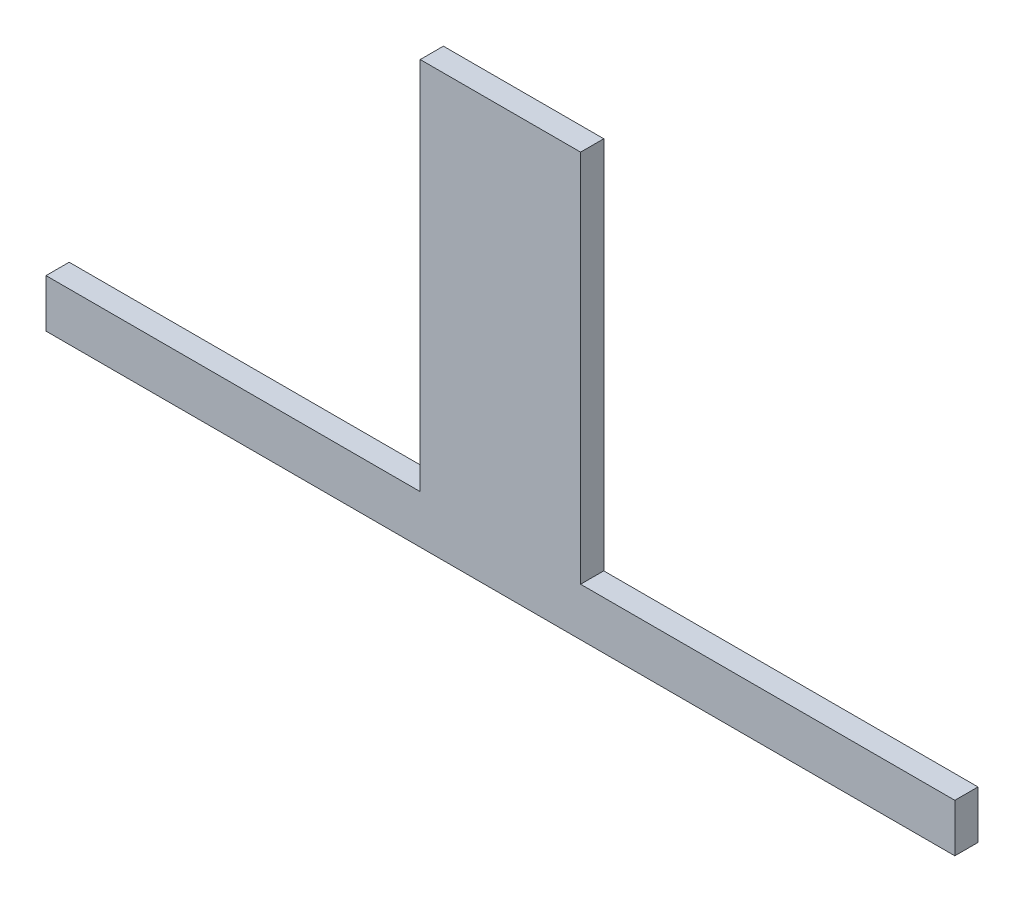
ISO-10303-21;
HEADER;
FILE_DESCRIPTION(('STEP AP214'),'2;1');
FILE_NAME('part.step','',(''),(''),'','','');
FILE_SCHEMA(('AUTOMOTIVE_DESIGN { 1 0 10303 214 1 1 1 1 }'));
ENDSEC;
DATA;
#1=APPLICATION_CONTEXT('core data for automotive mechanical design processes');
#2=APPLICATION_PROTOCOL_DEFINITION('international standard','automotive_design',2000,#1);
#3=PRODUCT_CONTEXT('',#1,'mechanical');
#4=PRODUCT('Part','Part','',(#3));
#5=PRODUCT_RELATED_PRODUCT_CATEGORY('part','',(#4));
#6=PRODUCT_DEFINITION_FORMATION('','',#4);
#7=PRODUCT_DEFINITION_CONTEXT('part definition',#1,'design');
#8=PRODUCT_DEFINITION('design','',#6,#7);
#9=PRODUCT_DEFINITION_SHAPE('','',#8);
#10=(LENGTH_UNIT() NAMED_UNIT(*) SI_UNIT(.MILLI.,.METRE.));
#11=(NAMED_UNIT(*) PLANE_ANGLE_UNIT() SI_UNIT($,.RADIAN.));
#12=(NAMED_UNIT(*) SI_UNIT($,.STERADIAN.) SOLID_ANGLE_UNIT());
#13=UNCERTAINTY_MEASURE_WITH_UNIT(LENGTH_MEASURE(1.E-05),#10,'distance_accuracy_value','');
#14=(GEOMETRIC_REPRESENTATION_CONTEXT(3) GLOBAL_UNCERTAINTY_ASSIGNED_CONTEXT((#13)) GLOBAL_UNIT_ASSIGNED_CONTEXT((#10,
#11,#12)) REPRESENTATION_CONTEXT('',''));
#15=CARTESIAN_POINT('',(0.,0.,0.));
#16=DIRECTION('',(0.,0.,1.));
#17=DIRECTION('',(1.,0.,0.));
#18=AXIS2_PLACEMENT_3D('',#15,#16,#17);
#19=CARTESIAN_POINT('',(0.,0.,0.));
#20=DIRECTION('',(0.,0.,1.));
#21=DIRECTION('',(1.,0.,0.));
#22=AXIS2_PLACEMENT_3D('',#19,#20,#21);
#23=PLANE('',#22);
#24=DIRECTION('',(1.,0.,0.));
#25=VECTOR('',#24,1.);
#26=CARTESIAN_POINT('',(-17.,0.5,0.));
#27=LINE('',#26,#25);
#28=CARTESIAN_POINT('',(-9.8076923076923,0.5,0.));
#29=VERTEX_POINT('',#28);
#30=CARTESIAN_POINT('',(9.80769230769232,0.5,0.));
#31=VERTEX_POINT('',#30);
#32=EDGE_CURVE('E11',#29,#31,#27,.T.);
#33=ORIENTED_EDGE('',*,*,#32,.F.);
#34=DIRECTION('',(0.,-1.,0.));
#35=VECTOR('',#34,1.);
#36=CARTESIAN_POINT('',(-9.8076923076923,1.53846153846154,0.));
#37=LINE('',#36,#35);
#38=CARTESIAN_POINT('',(-9.8076923076923,1.53846153846154,0.));
#39=VERTEX_POINT('',#38);
#40=EDGE_CURVE('E101',#39,#29,#37,.T.);
#41=ORIENTED_EDGE('',*,*,#40,.F.);
#42=DIRECTION('',(-1.,0.,0.));
#43=VECTOR('',#42,1.);
#44=CARTESIAN_POINT('',(-1.73076923076922,1.53846153846154,0.));
#45=LINE('',#44,#43);
#46=CARTESIAN_POINT('',(-1.73076923076922,1.53846153846154,0.));
#47=VERTEX_POINT('',#46);
#48=EDGE_CURVE('E143',#47,#39,#45,.T.);
#49=ORIENTED_EDGE('',*,*,#48,.F.);
#50=DIRECTION('',(0.,-1.,0.));
#51=VECTOR('',#50,1.);
#52=CARTESIAN_POINT('',(-1.73076923076922,9.61538461538461,0.));
#53=LINE('',#52,#51);
#54=CARTESIAN_POINT('',(-1.73076923076922,9.61538461538461,0.));
#55=VERTEX_POINT('',#54);
#56=EDGE_CURVE('E141',#55,#47,#53,.T.);
#57=ORIENTED_EDGE('',*,*,#56,.F.);
#58=DIRECTION('',(-1.,0.,0.));
#59=VECTOR('',#58,1.);
#60=CARTESIAN_POINT('',(1.73076923076924,9.61538461538461,0.));
#61=LINE('',#60,#59);
#62=CARTESIAN_POINT('',(1.73076923076924,9.61538461538461,0.));
#63=VERTEX_POINT('',#62);
#64=EDGE_CURVE('E138',#63,#55,#61,.T.);
#65=ORIENTED_EDGE('',*,*,#64,.F.);
#66=DIRECTION('',(0.,1.,0.));
#67=VECTOR('',#66,1.);
#68=CARTESIAN_POINT('',(1.73076923076924,1.53846153846154,0.));
#69=LINE('',#68,#67);
#70=CARTESIAN_POINT('',(1.73076923076924,1.53846153846154,0.));
#71=VERTEX_POINT('',#70);
#72=EDGE_CURVE('E134',#71,#63,#69,.T.);
#73=ORIENTED_EDGE('',*,*,#72,.F.);
#74=DIRECTION('',(-1.,0.,0.));
#75=VECTOR('',#74,1.);
#76=CARTESIAN_POINT('',(9.80769230769232,1.53846153846154,0.));
#77=LINE('',#76,#75);
#78=CARTESIAN_POINT('',(9.80769230769232,1.53846153846154,0.));
#79=VERTEX_POINT('',#78);
#80=EDGE_CURVE('E123',#79,#71,#77,.T.);
#81=ORIENTED_EDGE('',*,*,#80,.F.);
#82=DIRECTION('',(0.,1.,0.));
#83=VECTOR('',#82,1.);
#84=CARTESIAN_POINT('',(9.80769230769232,-1.92307692307692,0.));
#85=LINE('',#84,#83);
#86=EDGE_CURVE('E112',#31,#79,#85,.T.);
#87=ORIENTED_EDGE('',*,*,#86,.F.);
#88=EDGE_LOOP('',(#33,#41,#49,#57,#65,#73,#81,#87));
#89=FACE_BOUND('',#88,.T.);
#90=ADVANCED_FACE('F39',(#89),#23,.F.);
#91=CARTESIAN_POINT('',(9.80769230769232,-1.92307692307692,0.5));
#92=DIRECTION('',(-1.,0.,0.));
#93=DIRECTION('',(0.,0.,1.));
#94=AXIS2_PLACEMENT_3D('',#91,#92,#93);
#95=PLANE('',#94);
#96=DIRECTION('',(0.,1.,0.));
#97=VECTOR('',#96,1.);
#98=CARTESIAN_POINT('',(9.80769230769232,-1.92307692307692,0.5));
#99=LINE('',#98,#97);
#100=CARTESIAN_POINT('',(9.80769230769232,0.5,0.5));
#101=VERTEX_POINT('',#100);
#102=CARTESIAN_POINT('',(9.80769230769232,1.53846153846154,0.5));
#103=VERTEX_POINT('',#102);
#104=EDGE_CURVE('E119',#101,#103,#99,.T.);
#105=ORIENTED_EDGE('',*,*,#104,.F.);
#106=DIRECTION('',(0.,0.,-1.));
#107=VECTOR('',#106,1.);
#108=CARTESIAN_POINT('',(9.80769230769232,0.5,0.5));
#109=LINE('',#108,#107);
#110=EDGE_CURVE('E52',#101,#31,#109,.T.);
#111=ORIENTED_EDGE('',*,*,#110,.T.);
#112=ORIENTED_EDGE('',*,*,#86,.T.);
#113=DIRECTION('',(0.,0.,-1.));
#114=VECTOR('',#113,1.);
#115=CARTESIAN_POINT('',(9.80769230769232,1.53846153846154,0.5));
#116=LINE('',#115,#114);
#117=EDGE_CURVE('E132',#103,#79,#116,.T.);
#118=ORIENTED_EDGE('',*,*,#117,.F.);
#119=EDGE_LOOP('',(#105,#111,#112,#118));
#120=FACE_BOUND('',#119,.T.);
#121=ADVANCED_FACE('F179',(#120),#95,.F.);
#122=CARTESIAN_POINT('',(-9.8076923076923,1.53846153846154,0.5));
#123=DIRECTION('',(1.,0.,0.));
#124=DIRECTION('',(0.,0.,-1.));
#125=AXIS2_PLACEMENT_3D('',#122,#123,#124);
#126=PLANE('',#125);
#127=ORIENTED_EDGE('',*,*,#40,.T.);
#128=DIRECTION('',(0.,0.,1.));
#129=VECTOR('',#128,1.);
#130=CARTESIAN_POINT('',(-9.8076923076923,0.5,0.5));
#131=LINE('',#130,#129);
#132=CARTESIAN_POINT('',(-9.8076923076923,0.5,0.5));
#133=VERTEX_POINT('',#132);
#134=EDGE_CURVE('E96',#29,#133,#131,.T.);
#135=ORIENTED_EDGE('',*,*,#134,.T.);
#136=DIRECTION('',(0.,-1.,0.));
#137=VECTOR('',#136,1.);
#138=CARTESIAN_POINT('',(-9.8076923076923,1.53846153846154,0.5));
#139=LINE('',#138,#137);
#140=CARTESIAN_POINT('',(-9.8076923076923,1.53846153846154,0.5));
#141=VERTEX_POINT('',#140);
#142=EDGE_CURVE('E118',#141,#133,#139,.T.);
#143=ORIENTED_EDGE('',*,*,#142,.F.);
#144=DIRECTION('',(0.,0.,-1.));
#145=VECTOR('',#144,1.);
#146=CARTESIAN_POINT('',(-9.8076923076923,1.53846153846154,0.5));
#147=LINE('',#146,#145);
#148=EDGE_CURVE('E104',#141,#39,#147,.T.);
#149=ORIENTED_EDGE('',*,*,#148,.T.);
#150=EDGE_LOOP('',(#127,#135,#143,#149));
#151=FACE_BOUND('',#150,.T.);
#152=ADVANCED_FACE('F111',(#151),#126,.F.);
#153=CARTESIAN_POINT('',(0.,0.,0.5));
#154=DIRECTION('',(0.,0.,1.));
#155=DIRECTION('',(1.,0.,0.));
#156=AXIS2_PLACEMENT_3D('',#153,#154,#155);
#157=PLANE('',#156);
#158=DIRECTION('',(-1.,0.,0.));
#159=VECTOR('',#158,1.);
#160=CARTESIAN_POINT('',(0.,0.5,0.5));
#161=LINE('',#160,#159);
#162=EDGE_CURVE('E50',#101,#133,#161,.T.);
#163=ORIENTED_EDGE('',*,*,#162,.F.);
#164=ORIENTED_EDGE('',*,*,#104,.T.);
#165=DIRECTION('',(-1.,0.,0.));
#166=VECTOR('',#165,1.);
#167=CARTESIAN_POINT('',(9.80769230769232,1.53846153846154,0.5));
#168=LINE('',#167,#166);
#169=CARTESIAN_POINT('',(1.73076923076924,1.53846153846154,0.5));
#170=VERTEX_POINT('',#169);
#171=EDGE_CURVE('E116',#103,#170,#168,.T.);
#172=ORIENTED_EDGE('',*,*,#171,.T.);
#173=DIRECTION('',(0.,1.,0.));
#174=VECTOR('',#173,1.);
#175=CARTESIAN_POINT('',(1.73076923076924,1.53846153846154,0.5));
#176=LINE('',#175,#174);
#177=CARTESIAN_POINT('',(1.73076923076924,9.61538461538461,0.5));
#178=VERTEX_POINT('',#177);
#179=EDGE_CURVE('E128',#170,#178,#176,.T.);
#180=ORIENTED_EDGE('',*,*,#179,.T.);
#181=DIRECTION('',(-1.,0.,0.));
#182=VECTOR('',#181,1.);
#183=CARTESIAN_POINT('',(1.73076923076924,9.61538461538461,0.5));
#184=LINE('',#183,#182);
#185=CARTESIAN_POINT('',(-1.73076923076922,9.61538461538461,0.5));
#186=VERTEX_POINT('',#185);
#187=EDGE_CURVE('E126',#178,#186,#184,.T.);
#188=ORIENTED_EDGE('',*,*,#187,.T.);
#189=DIRECTION('',(0.,-1.,0.));
#190=VECTOR('',#189,1.);
#191=CARTESIAN_POINT('',(-1.73076923076922,9.61538461538461,0.5));
#192=LINE('',#191,#190);
#193=CARTESIAN_POINT('',(-1.73076923076922,1.53846153846154,0.5));
#194=VERTEX_POINT('',#193);
#195=EDGE_CURVE('E127',#186,#194,#192,.T.);
#196=ORIENTED_EDGE('',*,*,#195,.T.);
#197=DIRECTION('',(-1.,0.,0.));
#198=VECTOR('',#197,1.);
#199=CARTESIAN_POINT('',(-1.73076923076922,1.53846153846154,0.5));
#200=LINE('',#199,#198);
#201=EDGE_CURVE('E122',#194,#141,#200,.T.);
#202=ORIENTED_EDGE('',*,*,#201,.T.);
#203=ORIENTED_EDGE('',*,*,#142,.T.);
#204=EDGE_LOOP('',(#163,#164,#172,#180,#188,#196,#202,#203));
#205=FACE_BOUND('',#204,.T.);
#206=ADVANCED_FACE('F178',(#205),#157,.T.);
#207=CARTESIAN_POINT('',(9.80769230769232,1.53846153846154,0.5));
#208=DIRECTION('',(0.,-1.,0.));
#209=DIRECTION('',(0.,0.,-1.));
#210=AXIS2_PLACEMENT_3D('',#207,#208,#209);
#211=PLANE('',#210);
#212=ORIENTED_EDGE('',*,*,#80,.T.);
#213=DIRECTION('',(0.,0.,-1.));
#214=VECTOR('',#213,1.);
#215=CARTESIAN_POINT('',(1.73076923076924,1.53846153846154,0.5));
#216=LINE('',#215,#214);
#217=EDGE_CURVE('E140',#170,#71,#216,.T.);
#218=ORIENTED_EDGE('',*,*,#217,.F.);
#219=ORIENTED_EDGE('',*,*,#171,.F.);
#220=ORIENTED_EDGE('',*,*,#117,.T.);
#221=EDGE_LOOP('',(#212,#218,#219,#220));
#222=FACE_BOUND('',#221,.T.);
#223=ADVANCED_FACE('F162',(#222),#211,.F.);
#224=CARTESIAN_POINT('',(1.73076923076924,1.53846153846154,0.5));
#225=DIRECTION('',(-1.,0.,0.));
#226=DIRECTION('',(0.,0.,1.));
#227=AXIS2_PLACEMENT_3D('',#224,#225,#226);
#228=PLANE('',#227);
#229=ORIENTED_EDGE('',*,*,#72,.T.);
#230=DIRECTION('',(0.,0.,-1.));
#231=VECTOR('',#230,1.);
#232=CARTESIAN_POINT('',(1.73076923076924,9.61538461538461,0.5));
#233=LINE('',#232,#231);
#234=EDGE_CURVE('E139',#178,#63,#233,.T.);
#235=ORIENTED_EDGE('',*,*,#234,.F.);
#236=ORIENTED_EDGE('',*,*,#179,.F.);
#237=ORIENTED_EDGE('',*,*,#217,.T.);
#238=EDGE_LOOP('',(#229,#235,#236,#237));
#239=FACE_BOUND('',#238,.T.);
#240=ADVANCED_FACE('F169',(#239),#228,.F.);
#241=CARTESIAN_POINT('',(1.73076923076924,9.61538461538461,0.5));
#242=DIRECTION('',(0.,-1.,0.));
#243=DIRECTION('',(0.,0.,-1.));
#244=AXIS2_PLACEMENT_3D('',#241,#242,#243);
#245=PLANE('',#244);
#246=ORIENTED_EDGE('',*,*,#64,.T.);
#247=DIRECTION('',(0.,0.,-1.));
#248=VECTOR('',#247,1.);
#249=CARTESIAN_POINT('',(-1.73076923076922,9.61538461538461,0.5));
#250=LINE('',#249,#248);
#251=EDGE_CURVE('E142',#186,#55,#250,.T.);
#252=ORIENTED_EDGE('',*,*,#251,.F.);
#253=ORIENTED_EDGE('',*,*,#187,.F.);
#254=ORIENTED_EDGE('',*,*,#234,.T.);
#255=EDGE_LOOP('',(#246,#252,#253,#254));
#256=FACE_BOUND('',#255,.T.);
#257=ADVANCED_FACE('F174',(#256),#245,.F.);
#258=CARTESIAN_POINT('',(-1.73076923076922,9.61538461538461,0.5));
#259=DIRECTION('',(1.,0.,0.));
#260=DIRECTION('',(0.,0.,-1.));
#261=AXIS2_PLACEMENT_3D('',#258,#259,#260);
#262=PLANE('',#261);
#263=ORIENTED_EDGE('',*,*,#56,.T.);
#264=DIRECTION('',(0.,0.,-1.));
#265=VECTOR('',#264,1.);
#266=CARTESIAN_POINT('',(-1.73076923076922,1.53846153846154,0.5));
#267=LINE('',#266,#265);
#268=EDGE_CURVE('E147',#194,#47,#267,.T.);
#269=ORIENTED_EDGE('',*,*,#268,.F.);
#270=ORIENTED_EDGE('',*,*,#195,.F.);
#271=ORIENTED_EDGE('',*,*,#251,.T.);
#272=EDGE_LOOP('',(#263,#269,#270,#271));
#273=FACE_BOUND('',#272,.T.);
#274=ADVANCED_FACE('F197',(#273),#262,.F.);
#275=CARTESIAN_POINT('',(-1.73076923076922,1.53846153846154,0.5));
#276=DIRECTION('',(0.,-1.,0.));
#277=DIRECTION('',(0.,0.,-1.));
#278=AXIS2_PLACEMENT_3D('',#275,#276,#277);
#279=PLANE('',#278);
#280=ORIENTED_EDGE('',*,*,#48,.T.);
#281=ORIENTED_EDGE('',*,*,#148,.F.);
#282=ORIENTED_EDGE('',*,*,#201,.F.);
#283=ORIENTED_EDGE('',*,*,#268,.T.);
#284=EDGE_LOOP('',(#280,#281,#282,#283));
#285=FACE_BOUND('',#284,.T.);
#286=ADVANCED_FACE('F194',(#285),#279,.F.);
#287=CARTESIAN_POINT('',(-17.,0.5,1.));
#288=DIRECTION('',(0.,1.,0.));
#289=DIRECTION('',(0.,0.,1.));
#290=AXIS2_PLACEMENT_3D('',#287,#288,#289);
#291=PLANE('',#290);
#292=ORIENTED_EDGE('',*,*,#162,.T.);
#293=ORIENTED_EDGE('',*,*,#134,.F.);
#294=ORIENTED_EDGE('',*,*,#32,.T.);
#295=ORIENTED_EDGE('',*,*,#110,.F.);
#296=EDGE_LOOP('',(#292,#293,#294,#295));
#297=FACE_BOUND('',#296,.T.);
#298=ADVANCED_FACE('F97',(#297),#291,.F.);
#299=CLOSED_SHELL('',(#90,#121,#152,#206,#223,#240,#257,#274,#286,#298));
#300=MANIFOLD_SOLID_BREP('B2',#299);
#301=ADVANCED_BREP_SHAPE_REPRESENTATION('',(#18,#300),#14);
#302=SHAPE_DEFINITION_REPRESENTATION(#9,#301);
ENDSEC;
END-ISO-10303-21;
